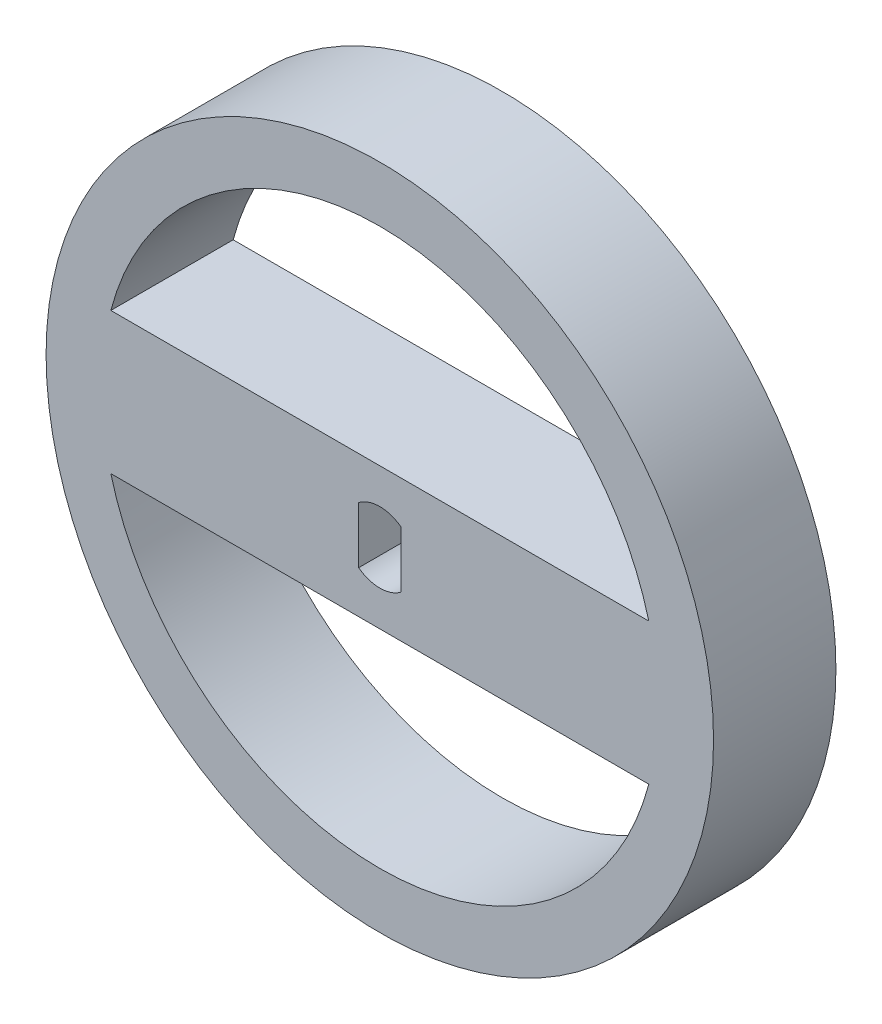
ISO-10303-21;
HEADER;
FILE_DESCRIPTION(('STEP AP214'),'2;1');
FILE_NAME('part.step','',(''),(''),'','','');
FILE_SCHEMA(('AUTOMOTIVE_DESIGN { 1 0 10303 214 1 1 1 1 }'));
ENDSEC;
DATA;
#1=APPLICATION_CONTEXT('core data for automotive mechanical design processes');
#2=APPLICATION_PROTOCOL_DEFINITION('international standard','automotive_design',2000,#1);
#3=PRODUCT_CONTEXT('',#1,'mechanical');
#4=PRODUCT('Part','Part','',(#3));
#5=PRODUCT_RELATED_PRODUCT_CATEGORY('part','',(#4));
#6=PRODUCT_DEFINITION_FORMATION('','',#4);
#7=PRODUCT_DEFINITION_CONTEXT('part definition',#1,'design');
#8=PRODUCT_DEFINITION('design','',#6,#7);
#9=PRODUCT_DEFINITION_SHAPE('','',#8);
#10=(LENGTH_UNIT() NAMED_UNIT(*) SI_UNIT(.MILLI.,.METRE.));
#11=(NAMED_UNIT(*) PLANE_ANGLE_UNIT() SI_UNIT($,.RADIAN.));
#12=(NAMED_UNIT(*) SI_UNIT($,.STERADIAN.) SOLID_ANGLE_UNIT());
#13=UNCERTAINTY_MEASURE_WITH_UNIT(LENGTH_MEASURE(1.E-05),#10,'distance_accuracy_value','');
#14=(GEOMETRIC_REPRESENTATION_CONTEXT(3) GLOBAL_UNCERTAINTY_ASSIGNED_CONTEXT((#13)) GLOBAL_UNIT_ASSIGNED_CONTEXT((#10,
#11,#12)) REPRESENTATION_CONTEXT('',''));
#15=CARTESIAN_POINT('',(0.,0.,0.));
#16=DIRECTION('',(0.,0.,1.));
#17=DIRECTION('',(1.,0.,0.));
#18=AXIS2_PLACEMENT_3D('',#15,#16,#17);
#19=CARTESIAN_POINT('',(0.,0.,0.));
#20=DIRECTION('',(0.,0.,1.));
#21=DIRECTION('',(1.,0.,0.));
#22=AXIS2_PLACEMENT_3D('',#19,#20,#21);
#23=PLANE('',#22);
#24=CARTESIAN_POINT('',(-124.832414552382,99.6248155500755,0.));
#25=DIRECTION('',(0.,0.,1.));
#26=DIRECTION('',(1.,0.,0.));
#27=AXIS2_PLACEMENT_3D('',#24,#25,#26);
#28=CIRCLE('',#27,25.);
#29=CARTESIAN_POINT('',(-149.012520011209,93.2748155500755,0.));
#30=VERTEX_POINT('',#29);
#31=CARTESIAN_POINT('',(-100.652309093555,93.2748155500755,0.));
#32=VERTEX_POINT('',#31);
#33=EDGE_CURVE('E152',#30,#32,#28,.T.);
#34=ORIENTED_EDGE('',*,*,#33,.F.);
#35=DIRECTION('',(1.,0.,0.));
#36=VECTOR('',#35,1.);
#37=CARTESIAN_POINT('',(0.,93.2748155500755,0.));
#38=LINE('',#37,#36);
#39=EDGE_CURVE('E168',#30,#32,#38,.T.);
#40=ORIENTED_EDGE('',*,*,#39,.T.);
#41=EDGE_LOOP('',(#34,#40));
#42=FACE_BOUND('',#41,.T.);
#43=CARTESIAN_POINT('',(-100.652309093555,105.974815550076,0.));
#44=VERTEX_POINT('',#43);
#45=CARTESIAN_POINT('',(-149.012520011209,105.974815550076,0.));
#46=VERTEX_POINT('',#45);
#47=EDGE_CURVE('E169',#44,#46,#28,.T.);
#48=ORIENTED_EDGE('',*,*,#47,.F.);
#49=DIRECTION('',(1.,0.,0.));
#50=VECTOR('',#49,1.);
#51=CARTESIAN_POINT('',(0.,105.974815550076,0.));
#52=LINE('',#51,#50);
#53=EDGE_CURVE('E88',#46,#44,#52,.T.);
#54=ORIENTED_EDGE('',*,*,#53,.F.);
#55=EDGE_LOOP('',(#48,#54));
#56=FACE_BOUND('',#55,.T.);
#57=CARTESIAN_POINT('',(-124.832414552382,99.6248155500755,0.));
#58=DIRECTION('',(0.,0.,1.));
#59=DIRECTION('',(1.,0.,0.));
#60=AXIS2_PLACEMENT_3D('',#57,#58,#59);
#61=CIRCLE('',#60,30.);
#62=CARTESIAN_POINT('',(-94.8324145523824,99.6248155500755,0.));
#63=VERTEX_POINT('',#62);
#64=EDGE_CURVE('E159',#63,#63,#61,.T.);
#65=ORIENTED_EDGE('',*,*,#64,.T.);
#66=EDGE_LOOP('',(#65));
#67=FACE_BOUND('',#66,.T.);
#68=CARTESIAN_POINT('',(-124.832414552382,99.6248155500755,0.));
#69=DIRECTION('',(0.,0.,1.));
#70=DIRECTION('',(1.,0.,0.));
#71=AXIS2_PLACEMENT_3D('',#68,#69,#70);
#72=CIRCLE('',#71,3.175);
#73=CARTESIAN_POINT('',(-122.927414552382,102.164815550076,0.));
#74=VERTEX_POINT('',#73);
#75=CARTESIAN_POINT('',(-126.737414552382,102.164815550076,0.));
#76=VERTEX_POINT('',#75);
#77=EDGE_CURVE('E143',#74,#76,#72,.T.);
#78=ORIENTED_EDGE('',*,*,#77,.F.);
#79=DIRECTION('',(0.,-1.,0.));
#80=VECTOR('',#79,1.);
#81=CARTESIAN_POINT('',(-122.927414552382,0.,0.));
#82=LINE('',#81,#80);
#83=CARTESIAN_POINT('',(-122.927414552382,97.0848155500755,0.));
#84=VERTEX_POINT('',#83);
#85=EDGE_CURVE('E60',#74,#84,#82,.T.);
#86=ORIENTED_EDGE('',*,*,#85,.T.);
#87=CARTESIAN_POINT('',(-124.832414552382,99.6248155500755,0.));
#88=DIRECTION('',(0.,0.,1.));
#89=DIRECTION('',(1.,0.,0.));
#90=AXIS2_PLACEMENT_3D('',#87,#88,#89);
#91=CIRCLE('',#90,3.175);
#92=CARTESIAN_POINT('',(-126.737414552382,97.0848155500755,0.));
#93=VERTEX_POINT('',#92);
#94=EDGE_CURVE('E133',#93,#84,#91,.T.);
#95=ORIENTED_EDGE('',*,*,#94,.F.);
#96=DIRECTION('',(0.,-1.,0.));
#97=VECTOR('',#96,1.);
#98=CARTESIAN_POINT('',(-126.737414552382,0.,0.));
#99=LINE('',#98,#97);
#100=EDGE_CURVE('E145',#76,#93,#99,.T.);
#101=ORIENTED_EDGE('',*,*,#100,.F.);
#102=EDGE_LOOP('',(#78,#86,#95,#101));
#103=FACE_BOUND('',#102,.T.);
#104=ADVANCED_FACE('F43',(#42,#56,#67,#103),#23,.T.);
#105=CARTESIAN_POINT('',(-124.832414552382,99.6248155500755,-11.));
#106=DIRECTION('',(0.,0.,1.));
#107=DIRECTION('',(1.,0.,0.));
#108=AXIS2_PLACEMENT_3D('',#105,#106,#107);
#109=CYLINDRICAL_SURFACE('',#108,25.);
#110=ORIENTED_EDGE('',*,*,#47,.T.);
#111=DIRECTION('',(0.,0.,1.));
#112=VECTOR('',#111,1.);
#113=CARTESIAN_POINT('',(-149.012520011209,105.974815550076,-11.));
#114=LINE('',#113,#112);
#115=CARTESIAN_POINT('',(-149.012520011209,105.974815550076,-11.));
#116=VERTEX_POINT('',#115);
#117=EDGE_CURVE('E11',#116,#46,#114,.T.);
#118=ORIENTED_EDGE('',*,*,#117,.F.);
#119=CARTESIAN_POINT('',(-124.832414552382,99.6248155500755,-11.));
#120=DIRECTION('',(0.,0.,1.));
#121=DIRECTION('',(1.,0.,0.));
#122=AXIS2_PLACEMENT_3D('',#119,#120,#121);
#123=CIRCLE('',#122,25.);
#124=CARTESIAN_POINT('',(-100.652309093555,105.974815550076,-11.));
#125=VERTEX_POINT('',#124);
#126=EDGE_CURVE('E160',#125,#116,#123,.T.);
#127=ORIENTED_EDGE('',*,*,#126,.F.);
#128=DIRECTION('',(0.,0.,1.));
#129=VECTOR('',#128,1.);
#130=CARTESIAN_POINT('',(-100.652309093555,105.974815550076,-11.));
#131=LINE('',#130,#129);
#132=EDGE_CURVE('E52',#125,#44,#131,.T.);
#133=ORIENTED_EDGE('',*,*,#132,.T.);
#134=EDGE_LOOP('',(#110,#118,#127,#133));
#135=FACE_BOUND('',#134,.T.);
#136=ADVANCED_FACE('F195',(#135),#109,.F.);
#137=ORIENTED_EDGE('',*,*,#33,.T.);
#138=DIRECTION('',(0.,0.,1.));
#139=VECTOR('',#138,1.);
#140=CARTESIAN_POINT('',(-100.652309093555,93.2748155500755,-11.));
#141=LINE('',#140,#139);
#142=CARTESIAN_POINT('',(-100.652309093555,93.2748155500755,-11.));
#143=VERTEX_POINT('',#142);
#144=EDGE_CURVE('E176',#143,#32,#141,.T.);
#145=ORIENTED_EDGE('',*,*,#144,.F.);
#146=CARTESIAN_POINT('',(-149.012520011209,93.2748155500755,-11.));
#147=VERTEX_POINT('',#146);
#148=EDGE_CURVE('E156',#147,#143,#123,.T.);
#149=ORIENTED_EDGE('',*,*,#148,.F.);
#150=DIRECTION('',(0.,0.,1.));
#151=VECTOR('',#150,1.);
#152=CARTESIAN_POINT('',(-149.012520011209,93.2748155500755,-11.));
#153=LINE('',#152,#151);
#154=EDGE_CURVE('E47',#147,#30,#153,.T.);
#155=ORIENTED_EDGE('',*,*,#154,.T.);
#156=EDGE_LOOP('',(#137,#145,#149,#155));
#157=FACE_BOUND('',#156,.T.);
#158=ADVANCED_FACE('F180',(#157),#109,.F.);
#159=CARTESIAN_POINT('',(0.,105.974815550076,-11.));
#160=DIRECTION('',(0.,-1.,0.));
#161=DIRECTION('',(0.,0.,-1.));
#162=AXIS2_PLACEMENT_3D('',#159,#160,#161);
#163=PLANE('',#162);
#164=ORIENTED_EDGE('',*,*,#53,.T.);
#165=ORIENTED_EDGE('',*,*,#132,.F.);
#166=DIRECTION('',(1.,0.,0.));
#167=VECTOR('',#166,1.);
#168=CARTESIAN_POINT('',(0.,105.974815550076,-11.));
#169=LINE('',#168,#167);
#170=EDGE_CURVE('E68',#116,#125,#169,.T.);
#171=ORIENTED_EDGE('',*,*,#170,.F.);
#172=ORIENTED_EDGE('',*,*,#117,.T.);
#173=EDGE_LOOP('',(#164,#165,#171,#172));
#174=FACE_BOUND('',#173,.T.);
#175=ADVANCED_FACE('F185',(#174),#163,.F.);
#176=CARTESIAN_POINT('',(0.,93.2748155500755,-11.));
#177=DIRECTION('',(0.,-1.,0.));
#178=DIRECTION('',(0.,0.,-1.));
#179=AXIS2_PLACEMENT_3D('',#176,#177,#178);
#180=PLANE('',#179);
#181=ORIENTED_EDGE('',*,*,#39,.F.);
#182=ORIENTED_EDGE('',*,*,#154,.F.);
#183=DIRECTION('',(1.,0.,0.));
#184=VECTOR('',#183,1.);
#185=CARTESIAN_POINT('',(0.,93.2748155500755,-11.));
#186=LINE('',#185,#184);
#187=EDGE_CURVE('E158',#147,#143,#186,.T.);
#188=ORIENTED_EDGE('',*,*,#187,.T.);
#189=ORIENTED_EDGE('',*,*,#144,.T.);
#190=EDGE_LOOP('',(#181,#182,#188,#189));
#191=FACE_BOUND('',#190,.T.);
#192=ADVANCED_FACE('F45',(#191),#180,.T.);
#193=CARTESIAN_POINT('',(-124.832414552382,99.6248155500755,-11.));
#194=DIRECTION('',(0.,0.,1.));
#195=DIRECTION('',(1.,0.,0.));
#196=AXIS2_PLACEMENT_3D('',#193,#194,#195);
#197=CYLINDRICAL_SURFACE('',#196,30.);
#198=CARTESIAN_POINT('',(-124.832414552382,99.6248155500755,-11.));
#199=DIRECTION('',(0.,0.,1.));
#200=DIRECTION('',(1.,0.,0.));
#201=AXIS2_PLACEMENT_3D('',#198,#199,#200);
#202=CIRCLE('',#201,30.);
#203=CARTESIAN_POINT('',(-94.8324145523824,99.6248155500755,-11.));
#204=VERTEX_POINT('',#203);
#205=EDGE_CURVE('E163',#204,#204,#202,.T.);
#206=ORIENTED_EDGE('',*,*,#205,.T.);
#207=EDGE_LOOP('',(#206));
#208=FACE_BOUND('',#207,.T.);
#209=ORIENTED_EDGE('',*,*,#64,.F.);
#210=EDGE_LOOP('',(#209));
#211=FACE_BOUND('',#210,.T.);
#212=ADVANCED_FACE('F184',(#208,#211),#197,.T.);
#213=CARTESIAN_POINT('',(0.,0.,-11.));
#214=DIRECTION('',(0.,0.,1.));
#215=DIRECTION('',(1.,0.,0.));
#216=AXIS2_PLACEMENT_3D('',#213,#214,#215);
#217=PLANE('',#216);
#218=ORIENTED_EDGE('',*,*,#148,.T.);
#219=ORIENTED_EDGE('',*,*,#187,.F.);
#220=EDGE_LOOP('',(#218,#219));
#221=FACE_BOUND('',#220,.T.);
#222=ORIENTED_EDGE('',*,*,#126,.T.);
#223=ORIENTED_EDGE('',*,*,#170,.T.);
#224=EDGE_LOOP('',(#222,#223));
#225=FACE_BOUND('',#224,.T.);
#226=ORIENTED_EDGE('',*,*,#205,.F.);
#227=EDGE_LOOP('',(#226));
#228=FACE_BOUND('',#227,.T.);
#229=ADVANCED_FACE('F190',(#221,#225,#228),#217,.F.);
#230=CARTESIAN_POINT('',(-122.927414552382,0.,-10.));
#231=DIRECTION('',(-1.,0.,0.));
#232=DIRECTION('',(0.,0.,1.));
#233=AXIS2_PLACEMENT_3D('',#230,#231,#232);
#234=PLANE('',#233);
#235=ORIENTED_EDGE('',*,*,#85,.F.);
#236=DIRECTION('',(0.,0.,1.));
#237=VECTOR('',#236,1.);
#238=CARTESIAN_POINT('',(-122.927414552382,102.164815550076,-10.));
#239=LINE('',#238,#237);
#240=CARTESIAN_POINT('',(-122.927414552382,102.164815550076,-10.));
#241=VERTEX_POINT('',#240);
#242=EDGE_CURVE('E114',#241,#74,#239,.T.);
#243=ORIENTED_EDGE('',*,*,#242,.F.);
#244=DIRECTION('',(0.,-1.,0.));
#245=VECTOR('',#244,1.);
#246=CARTESIAN_POINT('',(-122.927414552382,0.,-10.));
#247=LINE('',#246,#245);
#248=CARTESIAN_POINT('',(-122.927414552382,97.0848155500755,-10.));
#249=VERTEX_POINT('',#248);
#250=EDGE_CURVE('E117',#241,#249,#247,.T.);
#251=ORIENTED_EDGE('',*,*,#250,.T.);
#252=DIRECTION('',(0.,0.,1.));
#253=VECTOR('',#252,1.);
#254=CARTESIAN_POINT('',(-122.927414552382,97.0848155500755,-10.));
#255=LINE('',#254,#253);
#256=EDGE_CURVE('E150',#249,#84,#255,.T.);
#257=ORIENTED_EDGE('',*,*,#256,.T.);
#258=EDGE_LOOP('',(#235,#243,#251,#257));
#259=FACE_BOUND('',#258,.T.);
#260=ADVANCED_FACE('F116',(#259),#234,.T.);
#261=CARTESIAN_POINT('',(-124.832414552382,99.6248155500755,-10.));
#262=DIRECTION('',(0.,0.,1.));
#263=DIRECTION('',(1.,0.,0.));
#264=AXIS2_PLACEMENT_3D('',#261,#262,#263);
#265=CYLINDRICAL_SURFACE('',#264,3.175);
#266=ORIENTED_EDGE('',*,*,#94,.T.);
#267=ORIENTED_EDGE('',*,*,#256,.F.);
#268=CARTESIAN_POINT('',(-124.832414552382,99.6248155500755,-10.));
#269=DIRECTION('',(0.,0.,1.));
#270=DIRECTION('',(1.,0.,0.));
#271=AXIS2_PLACEMENT_3D('',#268,#269,#270);
#272=CIRCLE('',#271,3.175);
#273=CARTESIAN_POINT('',(-126.737414552382,97.0848155500755,-10.));
#274=VERTEX_POINT('',#273);
#275=EDGE_CURVE('E124',#274,#249,#272,.T.);
#276=ORIENTED_EDGE('',*,*,#275,.F.);
#277=DIRECTION('',(0.,0.,1.));
#278=VECTOR('',#277,1.);
#279=CARTESIAN_POINT('',(-126.737414552382,97.0848155500755,-10.));
#280=LINE('',#279,#278);
#281=EDGE_CURVE('E153',#274,#93,#280,.T.);
#282=ORIENTED_EDGE('',*,*,#281,.T.);
#283=EDGE_LOOP('',(#266,#267,#276,#282));
#284=FACE_BOUND('',#283,.T.);
#285=ADVANCED_FACE('F207',(#284),#265,.F.);
#286=CARTESIAN_POINT('',(-126.737414552382,0.,-10.));
#287=DIRECTION('',(-1.,0.,0.));
#288=DIRECTION('',(0.,0.,1.));
#289=AXIS2_PLACEMENT_3D('',#286,#287,#288);
#290=PLANE('',#289);
#291=ORIENTED_EDGE('',*,*,#100,.T.);
#292=ORIENTED_EDGE('',*,*,#281,.F.);
#293=DIRECTION('',(0.,-1.,0.));
#294=VECTOR('',#293,1.);
#295=CARTESIAN_POINT('',(-126.737414552382,0.,-10.));
#296=LINE('',#295,#294);
#297=CARTESIAN_POINT('',(-126.737414552382,102.164815550076,-10.));
#298=VERTEX_POINT('',#297);
#299=EDGE_CURVE('E137',#298,#274,#296,.T.);
#300=ORIENTED_EDGE('',*,*,#299,.F.);
#301=DIRECTION('',(0.,0.,1.));
#302=VECTOR('',#301,1.);
#303=CARTESIAN_POINT('',(-126.737414552382,102.164815550076,-10.));
#304=LINE('',#303,#302);
#305=EDGE_CURVE('E123',#298,#76,#304,.T.);
#306=ORIENTED_EDGE('',*,*,#305,.T.);
#307=EDGE_LOOP('',(#291,#292,#300,#306));
#308=FACE_BOUND('',#307,.T.);
#309=ADVANCED_FACE('F210',(#308),#290,.F.);
#310=CARTESIAN_POINT('',(-124.832414552382,99.6248155500755,-10.));
#311=DIRECTION('',(0.,0.,1.));
#312=DIRECTION('',(1.,0.,0.));
#313=AXIS2_PLACEMENT_3D('',#310,#311,#312);
#314=CYLINDRICAL_SURFACE('',#313,3.175);
#315=ORIENTED_EDGE('',*,*,#77,.T.);
#316=ORIENTED_EDGE('',*,*,#305,.F.);
#317=CARTESIAN_POINT('',(-124.832414552382,99.6248155500755,-10.));
#318=DIRECTION('',(0.,0.,1.));
#319=DIRECTION('',(1.,0.,0.));
#320=AXIS2_PLACEMENT_3D('',#317,#318,#319);
#321=CIRCLE('',#320,3.175);
#322=EDGE_CURVE('E131',#241,#298,#321,.T.);
#323=ORIENTED_EDGE('',*,*,#322,.F.);
#324=ORIENTED_EDGE('',*,*,#242,.T.);
#325=EDGE_LOOP('',(#315,#316,#323,#324));
#326=FACE_BOUND('',#325,.T.);
#327=ADVANCED_FACE('F135',(#326),#314,.F.);
#328=CARTESIAN_POINT('',(0.,0.,-10.));
#329=DIRECTION('',(0.,0.,1.));
#330=DIRECTION('',(1.,0.,0.));
#331=AXIS2_PLACEMENT_3D('',#328,#329,#330);
#332=PLANE('',#331);
#333=ORIENTED_EDGE('',*,*,#250,.F.);
#334=ORIENTED_EDGE('',*,*,#322,.T.);
#335=ORIENTED_EDGE('',*,*,#299,.T.);
#336=ORIENTED_EDGE('',*,*,#275,.T.);
#337=EDGE_LOOP('',(#333,#334,#335,#336));
#338=FACE_BOUND('',#337,.T.);
#339=ADVANCED_FACE('F129',(#338),#332,.T.);
#340=CLOSED_SHELL('',(#104,#136,#158,#175,#192,#212,#229,#260,#285,#309,#327,#339));
#341=MANIFOLD_SOLID_BREP('B2',#340);
#342=ADVANCED_BREP_SHAPE_REPRESENTATION('',(#18,#341),#14);
#343=SHAPE_DEFINITION_REPRESENTATION(#9,#342);
ENDSEC;
END-ISO-10303-21;
